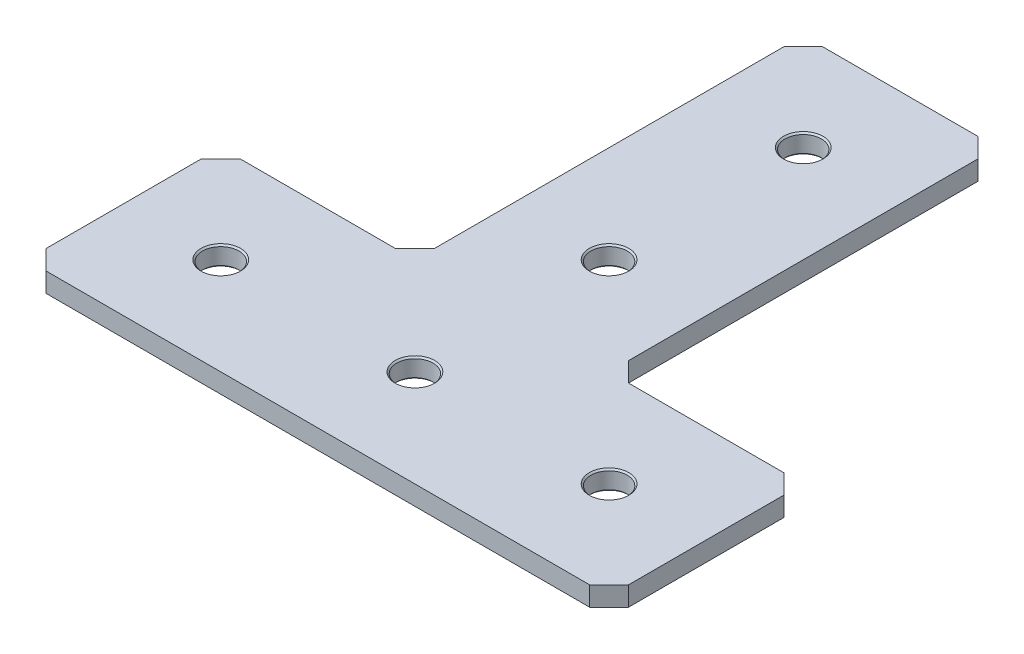
ISO-10303-21;
HEADER;
FILE_DESCRIPTION(('STEP AP214'),'2;1');
FILE_NAME('part.step','',(''),(''),'','','');
FILE_SCHEMA(('AUTOMOTIVE_DESIGN { 1 0 10303 214 1 1 1 1 }'));
ENDSEC;
DATA;
#1=APPLICATION_CONTEXT('core data for automotive mechanical design processes');
#2=APPLICATION_PROTOCOL_DEFINITION('international standard','automotive_design',2000,#1);
#3=PRODUCT_CONTEXT('',#1,'mechanical');
#4=PRODUCT('Part','Part','',(#3));
#5=PRODUCT_RELATED_PRODUCT_CATEGORY('part','',(#4));
#6=PRODUCT_DEFINITION_FORMATION('','',#4);
#7=PRODUCT_DEFINITION_CONTEXT('part definition',#1,'design');
#8=PRODUCT_DEFINITION('design','',#6,#7);
#9=PRODUCT_DEFINITION_SHAPE('','',#8);
#10=(LENGTH_UNIT() NAMED_UNIT(*) SI_UNIT(.MILLI.,.METRE.));
#11=(NAMED_UNIT(*) PLANE_ANGLE_UNIT() SI_UNIT($,.RADIAN.));
#12=(NAMED_UNIT(*) SI_UNIT($,.STERADIAN.) SOLID_ANGLE_UNIT());
#13=UNCERTAINTY_MEASURE_WITH_UNIT(LENGTH_MEASURE(1.E-05),#10,'distance_accuracy_value','');
#14=(GEOMETRIC_REPRESENTATION_CONTEXT(3) GLOBAL_UNCERTAINTY_ASSIGNED_CONTEXT((#13)) GLOBAL_UNIT_ASSIGNED_CONTEXT((#10,
#11,#12)) REPRESENTATION_CONTEXT('',''));
#15=CARTESIAN_POINT('',(0.,0.,0.));
#16=DIRECTION('',(0.,0.,1.));
#17=DIRECTION('',(1.,0.,0.));
#18=AXIS2_PLACEMENT_3D('',#15,#16,#17);
#19=CARTESIAN_POINT('',(0.,2.54,0.));
#20=DIRECTION('',(1.,0.,0.));
#21=DIRECTION('',(0.,0.,-1.));
#22=AXIS2_PLACEMENT_3D('',#19,#20,#21);
#23=PLANE('',#22);
#24=DIRECTION('',(0.,0.,1.));
#25=VECTOR('',#24,1.);
#26=CARTESIAN_POINT('',(0.,2.54,0.));
#27=LINE('',#26,#25);
#28=CARTESIAN_POINT('',(0.,2.54,-48.26));
#29=VERTEX_POINT('',#28);
#30=CARTESIAN_POINT('',(0.,2.54,-2.53999999999999));
#31=VERTEX_POINT('',#30);
#32=EDGE_CURVE('E195',#29,#31,#27,.T.);
#33=ORIENTED_EDGE('',*,*,#32,.F.);
#34=DIRECTION('',(0.,-1.,0.));
#35=VECTOR('',#34,1.);
#36=CARTESIAN_POINT('',(0.,2.54,-48.26));
#37=LINE('',#36,#35);
#38=CARTESIAN_POINT('',(0.,0.,-48.26));
#39=VERTEX_POINT('',#38);
#40=EDGE_CURVE('E241',#29,#39,#37,.T.);
#41=ORIENTED_EDGE('',*,*,#40,.T.);
#42=DIRECTION('',(0.,0.,1.));
#43=VECTOR('',#42,1.);
#44=CARTESIAN_POINT('',(0.,0.,0.));
#45=LINE('',#44,#43);
#46=CARTESIAN_POINT('',(0.,0.,-2.53999999999999));
#47=VERTEX_POINT('',#46);
#48=EDGE_CURVE('E632',#39,#47,#45,.T.);
#49=ORIENTED_EDGE('',*,*,#48,.T.);
#50=DIRECTION('',(0.,1.,0.));
#51=VECTOR('',#50,1.);
#52=CARTESIAN_POINT('',(0.,2.54,-2.53999999999999));
#53=LINE('',#52,#51);
#54=EDGE_CURVE('E239',#47,#31,#53,.T.);
#55=ORIENTED_EDGE('',*,*,#54,.T.);
#56=EDGE_LOOP('',(#33,#41,#49,#55));
#57=FACE_BOUND('',#56,.T.);
#58=ADVANCED_FACE('F37',(#57),#23,.F.);
#59=CARTESIAN_POINT('',(0.,2.54,0.));
#60=DIRECTION('',(0.,0.,1.));
#61=DIRECTION('',(1.,0.,0.));
#62=AXIS2_PLACEMENT_3D('',#59,#60,#61);
#63=PLANE('',#62);
#64=DIRECTION('',(-1.,0.,0.));
#65=VECTOR('',#64,1.);
#66=CARTESIAN_POINT('',(0.,0.,0.));
#67=LINE('',#66,#65);
#68=CARTESIAN_POINT('',(-2.54000000000001,0.,0.));
#69=VERTEX_POINT('',#68);
#70=CARTESIAN_POINT('',(-22.86,0.,0.));
#71=VERTEX_POINT('',#70);
#72=EDGE_CURVE('E184',#69,#71,#67,.T.);
#73=ORIENTED_EDGE('',*,*,#72,.T.);
#74=DIRECTION('',(0.,1.,0.));
#75=VECTOR('',#74,1.);
#76=CARTESIAN_POINT('',(-22.86,2.54,0.));
#77=LINE('',#76,#75);
#78=CARTESIAN_POINT('',(-22.86,2.54,0.));
#79=VERTEX_POINT('',#78);
#80=EDGE_CURVE('E247',#71,#79,#77,.T.);
#81=ORIENTED_EDGE('',*,*,#80,.T.);
#82=DIRECTION('',(-1.,0.,0.));
#83=VECTOR('',#82,1.);
#84=CARTESIAN_POINT('',(0.,2.54,0.));
#85=LINE('',#84,#83);
#86=CARTESIAN_POINT('',(-2.54000000000001,2.54,0.));
#87=VERTEX_POINT('',#86);
#88=EDGE_CURVE('E635',#87,#79,#85,.T.);
#89=ORIENTED_EDGE('',*,*,#88,.F.);
#90=DIRECTION('',(0.,-1.,0.));
#91=VECTOR('',#90,1.);
#92=CARTESIAN_POINT('',(-2.54000000000001,0.,0.));
#93=LINE('',#92,#91);
#94=EDGE_CURVE('E244',#87,#69,#93,.T.);
#95=ORIENTED_EDGE('',*,*,#94,.T.);
#96=EDGE_LOOP('',(#73,#81,#89,#95));
#97=FACE_BOUND('',#96,.T.);
#98=ADVANCED_FACE('F338',(#97),#63,.F.);
#99=CARTESIAN_POINT('',(-25.4,2.54,25.4));
#100=DIRECTION('',(1.,0.,0.));
#101=DIRECTION('',(0.,0.,-1.));
#102=AXIS2_PLACEMENT_3D('',#99,#100,#101);
#103=PLANE('',#102);
#104=DIRECTION('',(0.,0.,1.));
#105=VECTOR('',#104,1.);
#106=CARTESIAN_POINT('',(-25.4,0.,25.4));
#107=LINE('',#106,#105);
#108=CARTESIAN_POINT('',(-25.4,0.,2.53999999999999));
#109=VERTEX_POINT('',#108);
#110=CARTESIAN_POINT('',(-25.4,0.,22.86));
#111=VERTEX_POINT('',#110);
#112=EDGE_CURVE('E179',#109,#111,#107,.T.);
#113=ORIENTED_EDGE('',*,*,#112,.T.);
#114=DIRECTION('',(0.,1.,0.));
#115=VECTOR('',#114,1.);
#116=CARTESIAN_POINT('',(-25.4,2.54,22.86));
#117=LINE('',#116,#115);
#118=CARTESIAN_POINT('',(-25.4,2.54,22.86));
#119=VERTEX_POINT('',#118);
#120=EDGE_CURVE('E157',#111,#119,#117,.T.);
#121=ORIENTED_EDGE('',*,*,#120,.T.);
#122=DIRECTION('',(0.,0.,1.));
#123=VECTOR('',#122,1.);
#124=CARTESIAN_POINT('',(-25.4,2.54,25.4));
#125=LINE('',#124,#123);
#126=CARTESIAN_POINT('',(-25.4,2.54,2.53999999999999));
#127=VERTEX_POINT('',#126);
#128=EDGE_CURVE('E634',#127,#119,#125,.T.);
#129=ORIENTED_EDGE('',*,*,#128,.F.);
#130=DIRECTION('',(0.,-1.,0.));
#131=VECTOR('',#130,1.);
#132=CARTESIAN_POINT('',(-25.4,2.54,2.53999999999999));
#133=LINE('',#132,#131);
#134=EDGE_CURVE('E162',#127,#109,#133,.T.);
#135=ORIENTED_EDGE('',*,*,#134,.T.);
#136=EDGE_LOOP('',(#113,#121,#129,#135));
#137=FACE_BOUND('',#136,.T.);
#138=ADVANCED_FACE('F344',(#137),#103,.F.);
#139=CARTESIAN_POINT('',(50.8,2.54,25.4));
#140=DIRECTION('',(0.,0.,-1.));
#141=DIRECTION('',(-1.,0.,0.));
#142=AXIS2_PLACEMENT_3D('',#139,#140,#141);
#143=PLANE('',#142);
#144=DIRECTION('',(1.,0.,0.));
#145=VECTOR('',#144,1.);
#146=CARTESIAN_POINT('',(50.8,2.54,25.4));
#147=LINE('',#146,#145);
#148=CARTESIAN_POINT('',(-22.86,2.54,25.4));
#149=VERTEX_POINT('',#148);
#150=CARTESIAN_POINT('',(48.26,2.54,25.4));
#151=VERTEX_POINT('',#150);
#152=EDGE_CURVE('E172',#149,#151,#147,.T.);
#153=ORIENTED_EDGE('',*,*,#152,.F.);
#154=DIRECTION('',(0.,-1.,0.));
#155=VECTOR('',#154,1.);
#156=CARTESIAN_POINT('',(-22.86,2.54,25.4));
#157=LINE('',#156,#155);
#158=CARTESIAN_POINT('',(-22.86,0.,25.4));
#159=VERTEX_POINT('',#158);
#160=EDGE_CURVE('E156',#149,#159,#157,.T.);
#161=ORIENTED_EDGE('',*,*,#160,.T.);
#162=DIRECTION('',(1.,0.,0.));
#163=VECTOR('',#162,1.);
#164=CARTESIAN_POINT('',(50.8,0.,25.4));
#165=LINE('',#164,#163);
#166=CARTESIAN_POINT('',(48.26,0.,25.4));
#167=VERTEX_POINT('',#166);
#168=EDGE_CURVE('E169',#159,#167,#165,.T.);
#169=ORIENTED_EDGE('',*,*,#168,.T.);
#170=DIRECTION('',(0.,1.,0.));
#171=VECTOR('',#170,1.);
#172=CARTESIAN_POINT('',(48.26,2.54,25.4));
#173=LINE('',#172,#171);
#174=EDGE_CURVE('E174',#167,#151,#173,.T.);
#175=ORIENTED_EDGE('',*,*,#174,.T.);
#176=EDGE_LOOP('',(#153,#161,#169,#175));
#177=FACE_BOUND('',#176,.T.);
#178=ADVANCED_FACE('F168',(#177),#143,.F.);
#179=CARTESIAN_POINT('',(50.8,2.54,25.4));
#180=DIRECTION('',(-1.,0.,0.));
#181=DIRECTION('',(0.,0.,1.));
#182=AXIS2_PLACEMENT_3D('',#179,#180,#181);
#183=PLANE('',#182);
#184=DIRECTION('',(0.,0.,-1.));
#185=VECTOR('',#184,1.);
#186=CARTESIAN_POINT('',(50.8,2.54,25.4));
#187=LINE('',#186,#185);
#188=CARTESIAN_POINT('',(50.8,2.54,22.86));
#189=VERTEX_POINT('',#188);
#190=CARTESIAN_POINT('',(50.8,2.54,2.54000000000001));
#191=VERTEX_POINT('',#190);
#192=EDGE_CURVE('E637',#189,#191,#187,.T.);
#193=ORIENTED_EDGE('',*,*,#192,.F.);
#194=DIRECTION('',(0.,-1.,0.));
#195=VECTOR('',#194,1.);
#196=CARTESIAN_POINT('',(50.8,2.54,22.86));
#197=LINE('',#196,#195);
#198=CARTESIAN_POINT('',(50.8,0.,22.86));
#199=VERTEX_POINT('',#198);
#200=EDGE_CURVE('E222',#189,#199,#197,.T.);
#201=ORIENTED_EDGE('',*,*,#200,.T.);
#202=DIRECTION('',(0.,0.,-1.));
#203=VECTOR('',#202,1.);
#204=CARTESIAN_POINT('',(50.8,0.,25.4));
#205=LINE('',#204,#203);
#206=CARTESIAN_POINT('',(50.8,0.,2.54000000000001));
#207=VERTEX_POINT('',#206);
#208=EDGE_CURVE('E178',#199,#207,#205,.T.);
#209=ORIENTED_EDGE('',*,*,#208,.T.);
#210=DIRECTION('',(0.,1.,0.));
#211=VECTOR('',#210,1.);
#212=CARTESIAN_POINT('',(50.8,2.54,2.54));
#213=LINE('',#212,#211);
#214=EDGE_CURVE('E220',#207,#191,#213,.T.);
#215=ORIENTED_EDGE('',*,*,#214,.T.);
#216=EDGE_LOOP('',(#193,#201,#209,#215));
#217=FACE_BOUND('',#216,.T.);
#218=ADVANCED_FACE('F583',(#217),#183,.F.);
#219=CARTESIAN_POINT('',(50.8,2.54,0.));
#220=DIRECTION('',(0.,0.,1.));
#221=DIRECTION('',(1.,0.,0.));
#222=AXIS2_PLACEMENT_3D('',#219,#220,#221);
#223=PLANE('',#222);
#224=DIRECTION('',(-1.,0.,0.));
#225=VECTOR('',#224,1.);
#226=CARTESIAN_POINT('',(50.8,2.54,0.));
#227=LINE('',#226,#225);
#228=CARTESIAN_POINT('',(48.26,2.54,0.));
#229=VERTEX_POINT('',#228);
#230=CARTESIAN_POINT('',(27.94,2.54,0.));
#231=VERTEX_POINT('',#230);
#232=EDGE_CURVE('E644',#229,#231,#227,.T.);
#233=ORIENTED_EDGE('',*,*,#232,.F.);
#234=DIRECTION('',(0.,-1.,0.));
#235=VECTOR('',#234,1.);
#236=CARTESIAN_POINT('',(48.26,2.54,0.));
#237=LINE('',#236,#235);
#238=CARTESIAN_POINT('',(48.26,0.,0.));
#239=VERTEX_POINT('',#238);
#240=EDGE_CURVE('E227',#229,#239,#237,.T.);
#241=ORIENTED_EDGE('',*,*,#240,.T.);
#242=DIRECTION('',(-1.,0.,0.));
#243=VECTOR('',#242,1.);
#244=CARTESIAN_POINT('',(50.8,0.,0.));
#245=LINE('',#244,#243);
#246=CARTESIAN_POINT('',(27.94,0.,0.));
#247=VERTEX_POINT('',#246);
#248=EDGE_CURVE('E182',#239,#247,#245,.T.);
#249=ORIENTED_EDGE('',*,*,#248,.T.);
#250=DIRECTION('',(0.,1.,0.));
#251=VECTOR('',#250,1.);
#252=CARTESIAN_POINT('',(27.94,2.54,0.));
#253=LINE('',#252,#251);
#254=EDGE_CURVE('E225',#247,#231,#253,.T.);
#255=ORIENTED_EDGE('',*,*,#254,.T.);
#256=EDGE_LOOP('',(#233,#241,#249,#255));
#257=FACE_BOUND('',#256,.T.);
#258=ADVANCED_FACE('F573',(#257),#223,.F.);
#259=CARTESIAN_POINT('',(25.4,2.54,0.));
#260=DIRECTION('',(-1.,0.,0.));
#261=DIRECTION('',(0.,0.,1.));
#262=AXIS2_PLACEMENT_3D('',#259,#260,#261);
#263=PLANE('',#262);
#264=DIRECTION('',(0.,0.,-1.));
#265=VECTOR('',#264,1.);
#266=CARTESIAN_POINT('',(25.4,2.54,0.));
#267=LINE('',#266,#265);
#268=CARTESIAN_POINT('',(25.4,2.54,-2.53999999999999));
#269=VERTEX_POINT('',#268);
#270=CARTESIAN_POINT('',(25.4,2.54,-48.26));
#271=VERTEX_POINT('',#270);
#272=EDGE_CURVE('E647',#269,#271,#267,.T.);
#273=ORIENTED_EDGE('',*,*,#272,.F.);
#274=DIRECTION('',(0.,-1.,0.));
#275=VECTOR('',#274,1.);
#276=CARTESIAN_POINT('',(25.4,0.,-2.53999999999999));
#277=LINE('',#276,#275);
#278=CARTESIAN_POINT('',(25.4,0.,-2.53999999999999));
#279=VERTEX_POINT('',#278);
#280=EDGE_CURVE('E232',#269,#279,#277,.T.);
#281=ORIENTED_EDGE('',*,*,#280,.T.);
#282=DIRECTION('',(0.,0.,-1.));
#283=VECTOR('',#282,1.);
#284=CARTESIAN_POINT('',(25.4,0.,0.));
#285=LINE('',#284,#283);
#286=CARTESIAN_POINT('',(25.4,0.,-48.26));
#287=VERTEX_POINT('',#286);
#288=EDGE_CURVE('E190',#279,#287,#285,.T.);
#289=ORIENTED_EDGE('',*,*,#288,.T.);
#290=DIRECTION('',(0.,1.,0.));
#291=VECTOR('',#290,1.);
#292=CARTESIAN_POINT('',(25.4,2.54,-48.26));
#293=LINE('',#292,#291);
#294=EDGE_CURVE('E230',#287,#271,#293,.T.);
#295=ORIENTED_EDGE('',*,*,#294,.T.);
#296=EDGE_LOOP('',(#273,#281,#289,#295));
#297=FACE_BOUND('',#296,.T.);
#298=ADVANCED_FACE('F564',(#297),#263,.F.);
#299=CARTESIAN_POINT('',(0.,2.54,-50.8));
#300=DIRECTION('',(0.,0.,1.));
#301=DIRECTION('',(1.,0.,0.));
#302=AXIS2_PLACEMENT_3D('',#299,#300,#301);
#303=PLANE('',#302);
#304=DIRECTION('',(-1.,0.,0.));
#305=VECTOR('',#304,1.);
#306=CARTESIAN_POINT('',(0.,2.54,-50.8));
#307=LINE('',#306,#305);
#308=CARTESIAN_POINT('',(22.86,2.54,-50.8));
#309=VERTEX_POINT('',#308);
#310=CARTESIAN_POINT('',(2.54,2.54,-50.8));
#311=VERTEX_POINT('',#310);
#312=EDGE_CURVE('E196',#309,#311,#307,.T.);
#313=ORIENTED_EDGE('',*,*,#312,.F.);
#314=DIRECTION('',(0.,-1.,0.));
#315=VECTOR('',#314,1.);
#316=CARTESIAN_POINT('',(22.86,2.54,-50.8));
#317=LINE('',#316,#315);
#318=CARTESIAN_POINT('',(22.86,0.,-50.8));
#319=VERTEX_POINT('',#318);
#320=EDGE_CURVE('E236',#309,#319,#317,.T.);
#321=ORIENTED_EDGE('',*,*,#320,.T.);
#322=DIRECTION('',(-1.,0.,0.));
#323=VECTOR('',#322,1.);
#324=CARTESIAN_POINT('',(0.,0.,-50.8));
#325=LINE('',#324,#323);
#326=CARTESIAN_POINT('',(2.54,0.,-50.8));
#327=VERTEX_POINT('',#326);
#328=EDGE_CURVE('E193',#319,#327,#325,.T.);
#329=ORIENTED_EDGE('',*,*,#328,.T.);
#330=DIRECTION('',(0.,1.,0.));
#331=VECTOR('',#330,1.);
#332=CARTESIAN_POINT('',(2.54,2.54,-50.8));
#333=LINE('',#332,#331);
#334=EDGE_CURVE('E52',#327,#311,#333,.T.);
#335=ORIENTED_EDGE('',*,*,#334,.T.);
#336=EDGE_LOOP('',(#313,#321,#329,#335));
#337=FACE_BOUND('',#336,.T.);
#338=ADVANCED_FACE('F332',(#337),#303,.F.);
#339=CARTESIAN_POINT('',(0.,2.54,0.));
#340=DIRECTION('',(0.,-1.,0.));
#341=DIRECTION('',(0.,0.,-1.));
#342=AXIS2_PLACEMENT_3D('',#339,#340,#341);
#343=PLANE('',#342);
#344=CARTESIAN_POINT('',(-12.7,2.54,12.7));
#345=DIRECTION('',(0.,-1.,0.));
#346=DIRECTION('',(0.,0.,-1.));
#347=AXIS2_PLACEMENT_3D('',#344,#345,#346);
#348=CIRCLE('',#347,2.58124999999995);
#349=CARTESIAN_POINT('',(-12.7,2.54,10.11875));
#350=VERTEX_POINT('',#349);
#351=EDGE_CURVE('E275',#350,#350,#348,.T.);
#352=ORIENTED_EDGE('',*,*,#351,.T.);
#353=EDGE_LOOP('',(#352));
#354=FACE_BOUND('',#353,.T.);
#355=CARTESIAN_POINT('',(38.1,2.54,12.7));
#356=DIRECTION('',(0.,-1.,0.));
#357=DIRECTION('',(0.,0.,-1.));
#358=AXIS2_PLACEMENT_3D('',#355,#356,#357);
#359=CIRCLE('',#358,2.58124999999995);
#360=CARTESIAN_POINT('',(38.1,2.54,10.11875));
#361=VERTEX_POINT('',#360);
#362=EDGE_CURVE('E272',#361,#361,#359,.T.);
#363=ORIENTED_EDGE('',*,*,#362,.T.);
#364=EDGE_LOOP('',(#363));
#365=FACE_BOUND('',#364,.T.);
#366=CARTESIAN_POINT('',(12.7,2.54,12.7));
#367=DIRECTION('',(0.,-1.,0.));
#368=DIRECTION('',(0.,0.,-1.));
#369=AXIS2_PLACEMENT_3D('',#366,#367,#368);
#370=CIRCLE('',#369,2.58124999999999);
#371=CARTESIAN_POINT('',(12.7,2.54,10.11875));
#372=VERTEX_POINT('',#371);
#373=EDGE_CURVE('E269',#372,#372,#370,.T.);
#374=ORIENTED_EDGE('',*,*,#373,.T.);
#375=EDGE_LOOP('',(#374));
#376=FACE_BOUND('',#375,.T.);
#377=CARTESIAN_POINT('',(12.7,2.54,-12.7));
#378=DIRECTION('',(0.,-1.,0.));
#379=DIRECTION('',(0.,0.,-1.));
#380=AXIS2_PLACEMENT_3D('',#377,#378,#379);
#381=CIRCLE('',#380,2.58124999999999);
#382=CARTESIAN_POINT('',(12.7,2.54,-15.28125));
#383=VERTEX_POINT('',#382);
#384=EDGE_CURVE('E266',#383,#383,#381,.T.);
#385=ORIENTED_EDGE('',*,*,#384,.T.);
#386=EDGE_LOOP('',(#385));
#387=FACE_BOUND('',#386,.T.);
#388=CARTESIAN_POINT('',(12.7,2.54,-38.1));
#389=DIRECTION('',(0.,-1.,0.));
#390=DIRECTION('',(0.,0.,-1.));
#391=AXIS2_PLACEMENT_3D('',#388,#389,#390);
#392=CIRCLE('',#391,2.58124999999999);
#393=CARTESIAN_POINT('',(12.7,2.54,-40.68125));
#394=VERTEX_POINT('',#393);
#395=EDGE_CURVE('E263',#394,#394,#392,.T.);
#396=ORIENTED_EDGE('',*,*,#395,.T.);
#397=EDGE_LOOP('',(#396));
#398=FACE_BOUND('',#397,.T.);
#399=ORIENTED_EDGE('',*,*,#128,.T.);
#400=DIRECTION('',(-0.707106781186546,0.,-0.707106781186549));
#401=VECTOR('',#400,1.);
#402=CARTESIAN_POINT('',(-22.86,2.54,25.4));
#403=LINE('',#402,#401);
#404=EDGE_CURVE('E218',#119,#149,#403,.F.);
#405=ORIENTED_EDGE('',*,*,#404,.T.);
#406=ORIENTED_EDGE('',*,*,#152,.T.);
#407=DIRECTION('',(-0.707106781186548,0.,0.707106781186548));
#408=VECTOR('',#407,1.);
#409=CARTESIAN_POINT('',(50.8,2.54,22.86));
#410=LINE('',#409,#408);
#411=EDGE_CURVE('E216',#151,#189,#410,.F.);
#412=ORIENTED_EDGE('',*,*,#411,.T.);
#413=ORIENTED_EDGE('',*,*,#192,.T.);
#414=DIRECTION('',(0.707106781186547,0.,0.707106781186548));
#415=VECTOR('',#414,1.);
#416=CARTESIAN_POINT('',(48.26,2.54,0.));
#417=LINE('',#416,#415);
#418=EDGE_CURVE('E214',#191,#229,#417,.F.);
#419=ORIENTED_EDGE('',*,*,#418,.T.);
#420=ORIENTED_EDGE('',*,*,#232,.T.);
#421=DIRECTION('',(0.707106781186546,0.,0.707106781186549));
#422=VECTOR('',#421,1.);
#423=CARTESIAN_POINT('',(13.9700000000001,2.54,-13.97));
#424=LINE('',#423,#422);
#425=EDGE_CURVE('E251',#231,#269,#424,.F.);
#426=ORIENTED_EDGE('',*,*,#425,.T.);
#427=ORIENTED_EDGE('',*,*,#272,.T.);
#428=DIRECTION('',(0.707106781186548,0.,0.707106781186548));
#429=VECTOR('',#428,1.);
#430=CARTESIAN_POINT('',(22.86,2.54,-50.8));
#431=LINE('',#430,#429);
#432=EDGE_CURVE('E59',#271,#309,#431,.F.);
#433=ORIENTED_EDGE('',*,*,#432,.T.);
#434=ORIENTED_EDGE('',*,*,#312,.T.);
#435=DIRECTION('',(0.707106781186548,0.,-0.707106781186548));
#436=VECTOR('',#435,1.);
#437=CARTESIAN_POINT('',(0.,2.54,-48.26));
#438=LINE('',#437,#436);
#439=EDGE_CURVE('E211',#311,#29,#438,.F.);
#440=ORIENTED_EDGE('',*,*,#439,.T.);
#441=ORIENTED_EDGE('',*,*,#32,.T.);
#442=DIRECTION('',(0.707106781186551,0.,-0.707106781186544));
#443=VECTOR('',#442,1.);
#444=CARTESIAN_POINT('',(-1.26999999999999,2.54,-1.27000000000001));
#445=LINE('',#444,#443);
#446=EDGE_CURVE('E255',#31,#87,#445,.F.);
#447=ORIENTED_EDGE('',*,*,#446,.T.);
#448=ORIENTED_EDGE('',*,*,#88,.T.);
#449=DIRECTION('',(0.707106781186549,0.,-0.707106781186546));
#450=VECTOR('',#449,1.);
#451=CARTESIAN_POINT('',(-25.4,2.54,2.53999999999999));
#452=LINE('',#451,#450);
#453=EDGE_CURVE('E209',#79,#127,#452,.F.);
#454=ORIENTED_EDGE('',*,*,#453,.T.);
#455=EDGE_LOOP('',(#399,#405,#406,#412,#413,#419,#420,#426,#427,#433,#434,#440,#441,#447,#448,#454));
#456=FACE_BOUND('',#455,.T.);
#457=ADVANCED_FACE('F322',(#354,#365,#376,#387,#398,#456),#343,.F.);
#458=CARTESIAN_POINT('',(0.,0.,0.));
#459=DIRECTION('',(0.,-1.,0.));
#460=DIRECTION('',(0.,0.,-1.));
#461=AXIS2_PLACEMENT_3D('',#458,#459,#460);
#462=PLANE('',#461);
#463=CARTESIAN_POINT('',(-12.7,0.,12.7));
#464=DIRECTION('',(0.,-1.,0.));
#465=DIRECTION('',(0.,0.,-1.));
#466=AXIS2_PLACEMENT_3D('',#463,#464,#465);
#467=CIRCLE('',#466,2.58124999999999);
#468=CARTESIAN_POINT('',(-12.7,0.,10.11875));
#469=VERTEX_POINT('',#468);
#470=EDGE_CURVE('E290',#469,#469,#467,.F.);
#471=ORIENTED_EDGE('',*,*,#470,.T.);
#472=EDGE_LOOP('',(#471));
#473=FACE_BOUND('',#472,.T.);
#474=CARTESIAN_POINT('',(38.1,0.,12.7));
#475=DIRECTION('',(0.,-1.,0.));
#476=DIRECTION('',(0.,0.,-1.));
#477=AXIS2_PLACEMENT_3D('',#474,#475,#476);
#478=CIRCLE('',#477,2.58124999999999);
#479=CARTESIAN_POINT('',(38.1,0.,10.11875));
#480=VERTEX_POINT('',#479);
#481=EDGE_CURVE('E287',#480,#480,#478,.F.);
#482=ORIENTED_EDGE('',*,*,#481,.T.);
#483=EDGE_LOOP('',(#482));
#484=FACE_BOUND('',#483,.T.);
#485=CARTESIAN_POINT('',(12.7,0.,12.7));
#486=DIRECTION('',(0.,-1.,0.));
#487=DIRECTION('',(0.,0.,-1.));
#488=AXIS2_PLACEMENT_3D('',#485,#486,#487);
#489=CIRCLE('',#488,2.58124999999999);
#490=CARTESIAN_POINT('',(12.7,0.,10.11875));
#491=VERTEX_POINT('',#490);
#492=EDGE_CURVE('E284',#491,#491,#489,.F.);
#493=ORIENTED_EDGE('',*,*,#492,.T.);
#494=EDGE_LOOP('',(#493));
#495=FACE_BOUND('',#494,.T.);
#496=CARTESIAN_POINT('',(12.7,0.,-12.7));
#497=DIRECTION('',(0.,-1.,0.));
#498=DIRECTION('',(0.,0.,-1.));
#499=AXIS2_PLACEMENT_3D('',#496,#497,#498);
#500=CIRCLE('',#499,2.58124999999999);
#501=CARTESIAN_POINT('',(12.7,0.,-15.28125));
#502=VERTEX_POINT('',#501);
#503=EDGE_CURVE('E281',#502,#502,#500,.F.);
#504=ORIENTED_EDGE('',*,*,#503,.T.);
#505=EDGE_LOOP('',(#504));
#506=FACE_BOUND('',#505,.T.);
#507=CARTESIAN_POINT('',(12.7,0.,-38.1));
#508=DIRECTION('',(0.,-1.,0.));
#509=DIRECTION('',(0.,0.,-1.));
#510=AXIS2_PLACEMENT_3D('',#507,#508,#509);
#511=CIRCLE('',#510,2.58124999999999);
#512=CARTESIAN_POINT('',(12.7,0.,-40.68125));
#513=VERTEX_POINT('',#512);
#514=EDGE_CURVE('E278',#513,#513,#511,.F.);
#515=ORIENTED_EDGE('',*,*,#514,.T.);
#516=EDGE_LOOP('',(#515));
#517=FACE_BOUND('',#516,.T.);
#518=ORIENTED_EDGE('',*,*,#168,.F.);
#519=DIRECTION('',(0.707106781186546,0.,0.707106781186549));
#520=VECTOR('',#519,1.);
#521=CARTESIAN_POINT('',(-24.1300000000001,0.,24.13));
#522=LINE('',#521,#520);
#523=EDGE_CURVE('E152',#159,#111,#522,.F.);
#524=ORIENTED_EDGE('',*,*,#523,.T.);
#525=ORIENTED_EDGE('',*,*,#112,.F.);
#526=DIRECTION('',(-0.707106781186549,0.,0.707106781186546));
#527=VECTOR('',#526,1.);
#528=CARTESIAN_POINT('',(-11.4299999999999,0.,-11.43));
#529=LINE('',#528,#527);
#530=EDGE_CURVE('E173',#109,#71,#529,.F.);
#531=ORIENTED_EDGE('',*,*,#530,.T.);
#532=ORIENTED_EDGE('',*,*,#72,.F.);
#533=DIRECTION('',(-0.707106781186551,0.,0.707106781186544));
#534=VECTOR('',#533,1.);
#535=CARTESIAN_POINT('',(-2.54000000000001,0.,0.));
#536=LINE('',#535,#534);
#537=EDGE_CURVE('E253',#69,#47,#536,.F.);
#538=ORIENTED_EDGE('',*,*,#537,.T.);
#539=ORIENTED_EDGE('',*,*,#48,.F.);
#540=DIRECTION('',(-0.707106781186548,0.,0.707106781186548));
#541=VECTOR('',#540,1.);
#542=CARTESIAN_POINT('',(-24.13,0.,-24.13));
#543=LINE('',#542,#541);
#544=EDGE_CURVE('E199',#39,#327,#543,.F.);
#545=ORIENTED_EDGE('',*,*,#544,.T.);
#546=ORIENTED_EDGE('',*,*,#328,.F.);
#547=DIRECTION('',(-0.707106781186548,0.,-0.707106781186548));
#548=VECTOR('',#547,1.);
#549=CARTESIAN_POINT('',(36.83,0.,-36.83));
#550=LINE('',#549,#548);
#551=EDGE_CURVE('E201',#319,#287,#550,.F.);
#552=ORIENTED_EDGE('',*,*,#551,.T.);
#553=ORIENTED_EDGE('',*,*,#288,.F.);
#554=DIRECTION('',(-0.707106781186546,0.,-0.707106781186549));
#555=VECTOR('',#554,1.);
#556=CARTESIAN_POINT('',(25.4,0.,-2.53999999999999));
#557=LINE('',#556,#555);
#558=EDGE_CURVE('E249',#279,#247,#557,.F.);
#559=ORIENTED_EDGE('',*,*,#558,.T.);
#560=ORIENTED_EDGE('',*,*,#248,.F.);
#561=DIRECTION('',(-0.707106781186547,0.,-0.707106781186548));
#562=VECTOR('',#561,1.);
#563=CARTESIAN_POINT('',(24.13,0.,-24.13));
#564=LINE('',#563,#562);
#565=EDGE_CURVE('E203',#239,#207,#564,.F.);
#566=ORIENTED_EDGE('',*,*,#565,.T.);
#567=ORIENTED_EDGE('',*,*,#208,.F.);
#568=DIRECTION('',(0.707106781186548,0.,-0.707106781186548));
#569=VECTOR('',#568,1.);
#570=CARTESIAN_POINT('',(36.83,0.,36.83));
#571=LINE('',#570,#569);
#572=EDGE_CURVE('E163',#199,#167,#571,.F.);
#573=ORIENTED_EDGE('',*,*,#572,.T.);
#574=EDGE_LOOP('',(#518,#524,#525,#531,#532,#538,#539,#545,#546,#552,#553,#559,#560,#566,#567,#573));
#575=FACE_BOUND('',#574,.T.);
#576=ADVANCED_FACE('F176',(#473,#484,#495,#506,#517,#575),#462,.T.);
#577=CARTESIAN_POINT('',(-12.7,2.54,12.7));
#578=DIRECTION('',(0.,1.,0.));
#579=DIRECTION('',(0.,0.,1.));
#580=AXIS2_PLACEMENT_3D('',#577,#578,#579);
#581=CYLINDRICAL_SURFACE('',#580,2.38125);
#582=CARTESIAN_POINT('',(-12.7,2.34000000000004,12.7));
#583=DIRECTION('',(0.,-1.,0.));
#584=DIRECTION('',(0.,0.,-1.));
#585=AXIS2_PLACEMENT_3D('',#582,#583,#584);
#586=CIRCLE('',#585,2.38125);
#587=CARTESIAN_POINT('',(-12.7,2.34000000000004,10.31875));
#588=VERTEX_POINT('',#587);
#589=EDGE_CURVE('E260',#588,#588,#586,.F.);
#590=ORIENTED_EDGE('',*,*,#589,.T.);
#591=EDGE_LOOP('',(#590));
#592=FACE_BOUND('',#591,.T.);
#593=CARTESIAN_POINT('',(-12.7,0.199999999999988,12.7));
#594=DIRECTION('',(0.,-1.,0.));
#595=DIRECTION('',(0.,0.,-1.));
#596=AXIS2_PLACEMENT_3D('',#593,#594,#595);
#597=CIRCLE('',#596,2.38125);
#598=CARTESIAN_POINT('',(-12.7,0.199999999999988,10.31875));
#599=VERTEX_POINT('',#598);
#600=EDGE_CURVE('E257',#599,#599,#597,.T.);
#601=ORIENTED_EDGE('',*,*,#600,.T.);
#602=EDGE_LOOP('',(#601));
#603=FACE_BOUND('',#602,.T.);
#604=ADVANCED_FACE('F321',(#592,#603),#581,.F.);
#605=CARTESIAN_POINT('',(38.1,2.54,12.7));
#606=DIRECTION('',(0.,1.,0.));
#607=DIRECTION('',(0.,0.,1.));
#608=AXIS2_PLACEMENT_3D('',#605,#606,#607);
#609=CYLINDRICAL_SURFACE('',#608,2.38125);
#610=CARTESIAN_POINT('',(38.1,2.34000000000004,12.7));
#611=DIRECTION('',(0.,-1.,0.));
#612=DIRECTION('',(0.,0.,-1.));
#613=AXIS2_PLACEMENT_3D('',#610,#611,#612);
#614=CIRCLE('',#613,2.38125);
#615=CARTESIAN_POINT('',(38.1,2.34000000000004,10.31875));
#616=VERTEX_POINT('',#615);
#617=EDGE_CURVE('E296',#616,#616,#614,.F.);
#618=ORIENTED_EDGE('',*,*,#617,.T.);
#619=EDGE_LOOP('',(#618));
#620=FACE_BOUND('',#619,.T.);
#621=CARTESIAN_POINT('',(38.1,0.199999999999986,12.7));
#622=DIRECTION('',(0.,-1.,0.));
#623=DIRECTION('',(0.,0.,-1.));
#624=AXIS2_PLACEMENT_3D('',#621,#622,#623);
#625=CIRCLE('',#624,2.38125);
#626=CARTESIAN_POINT('',(38.1,0.199999999999986,10.31875));
#627=VERTEX_POINT('',#626);
#628=EDGE_CURVE('E293',#627,#627,#625,.T.);
#629=ORIENTED_EDGE('',*,*,#628,.T.);
#630=EDGE_LOOP('',(#629));
#631=FACE_BOUND('',#630,.T.);
#632=ADVANCED_FACE('F329',(#620,#631),#609,.F.);
#633=CARTESIAN_POINT('',(12.7,2.54,12.7));
#634=DIRECTION('',(0.,1.,0.));
#635=DIRECTION('',(0.,0.,1.));
#636=AXIS2_PLACEMENT_3D('',#633,#634,#635);
#637=CYLINDRICAL_SURFACE('',#636,2.38125);
#638=CARTESIAN_POINT('',(12.7,2.33999999999999,12.7));
#639=DIRECTION('',(0.,-1.,0.));
#640=DIRECTION('',(0.,0.,-1.));
#641=AXIS2_PLACEMENT_3D('',#638,#639,#640);
#642=CIRCLE('',#641,2.38125);
#643=CARTESIAN_POINT('',(12.7,2.33999999999999,10.31875));
#644=VERTEX_POINT('',#643);
#645=EDGE_CURVE('E302',#644,#644,#642,.F.);
#646=ORIENTED_EDGE('',*,*,#645,.T.);
#647=EDGE_LOOP('',(#646));
#648=FACE_BOUND('',#647,.T.);
#649=CARTESIAN_POINT('',(12.7,0.199999999999988,12.7));
#650=DIRECTION('',(0.,-1.,0.));
#651=DIRECTION('',(0.,0.,-1.));
#652=AXIS2_PLACEMENT_3D('',#649,#650,#651);
#653=CIRCLE('',#652,2.38125);
#654=CARTESIAN_POINT('',(12.7,0.199999999999988,10.31875));
#655=VERTEX_POINT('',#654);
#656=EDGE_CURVE('E299',#655,#655,#653,.T.);
#657=ORIENTED_EDGE('',*,*,#656,.T.);
#658=EDGE_LOOP('',(#657));
#659=FACE_BOUND('',#658,.T.);
#660=ADVANCED_FACE('F425',(#648,#659),#637,.F.);
#661=CARTESIAN_POINT('',(12.7,2.54,-12.7));
#662=DIRECTION('',(0.,1.,0.));
#663=DIRECTION('',(0.,0.,1.));
#664=AXIS2_PLACEMENT_3D('',#661,#662,#663);
#665=CYLINDRICAL_SURFACE('',#664,2.38125);
#666=CARTESIAN_POINT('',(12.7,2.33999999999999,-12.7));
#667=DIRECTION('',(0.,-1.,0.));
#668=DIRECTION('',(0.,0.,-1.));
#669=AXIS2_PLACEMENT_3D('',#666,#667,#668);
#670=CIRCLE('',#669,2.38125);
#671=CARTESIAN_POINT('',(12.7,2.33999999999999,-15.08125));
#672=VERTEX_POINT('',#671);
#673=EDGE_CURVE('E308',#672,#672,#670,.F.);
#674=ORIENTED_EDGE('',*,*,#673,.T.);
#675=EDGE_LOOP('',(#674));
#676=FACE_BOUND('',#675,.T.);
#677=CARTESIAN_POINT('',(12.7,0.199999999999988,-12.7));
#678=DIRECTION('',(0.,-1.,0.));
#679=DIRECTION('',(0.,0.,-1.));
#680=AXIS2_PLACEMENT_3D('',#677,#678,#679);
#681=CIRCLE('',#680,2.38125);
#682=CARTESIAN_POINT('',(12.7,0.199999999999988,-15.08125));
#683=VERTEX_POINT('',#682);
#684=EDGE_CURVE('E305',#683,#683,#681,.T.);
#685=ORIENTED_EDGE('',*,*,#684,.T.);
#686=EDGE_LOOP('',(#685));
#687=FACE_BOUND('',#686,.T.);
#688=ADVANCED_FACE('F420',(#676,#687),#665,.F.);
#689=CARTESIAN_POINT('',(12.7,2.54,-38.1));
#690=DIRECTION('',(0.,1.,0.));
#691=DIRECTION('',(0.,0.,1.));
#692=AXIS2_PLACEMENT_3D('',#689,#690,#691);
#693=CYLINDRICAL_SURFACE('',#692,2.38125);
#694=CARTESIAN_POINT('',(12.7,2.33999999999999,-38.1));
#695=DIRECTION('',(0.,-1.,0.));
#696=DIRECTION('',(0.,0.,-1.));
#697=AXIS2_PLACEMENT_3D('',#694,#695,#696);
#698=CIRCLE('',#697,2.38125);
#699=CARTESIAN_POINT('',(12.7,2.33999999999999,-40.48125));
#700=VERTEX_POINT('',#699);
#701=EDGE_CURVE('E11',#700,#700,#698,.F.);
#702=ORIENTED_EDGE('',*,*,#701,.T.);
#703=EDGE_LOOP('',(#702));
#704=FACE_BOUND('',#703,.T.);
#705=CARTESIAN_POINT('',(12.7,0.199999999999988,-38.1));
#706=DIRECTION('',(0.,-1.,0.));
#707=DIRECTION('',(0.,0.,-1.));
#708=AXIS2_PLACEMENT_3D('',#705,#706,#707);
#709=CIRCLE('',#708,2.38125);
#710=CARTESIAN_POINT('',(12.7,0.199999999999988,-40.48125));
#711=VERTEX_POINT('',#710);
#712=EDGE_CURVE('E45',#711,#711,#709,.T.);
#713=ORIENTED_EDGE('',*,*,#712,.T.);
#714=EDGE_LOOP('',(#713));
#715=FACE_BOUND('',#714,.T.);
#716=ADVANCED_FACE('F313',(#704,#715),#693,.F.);
#717=CARTESIAN_POINT('',(-22.86,2.54,25.4));
#718=DIRECTION('',(0.707106781186549,0.,-0.707106781186546));
#719=DIRECTION('',(0.,-1.,0.));
#720=AXIS2_PLACEMENT_3D('',#717,#718,#719);
#721=PLANE('',#720);
#722=ORIENTED_EDGE('',*,*,#404,.F.);
#723=ORIENTED_EDGE('',*,*,#120,.F.);
#724=ORIENTED_EDGE('',*,*,#523,.F.);
#725=ORIENTED_EDGE('',*,*,#160,.F.);
#726=EDGE_LOOP('',(#722,#723,#724,#725));
#727=FACE_BOUND('',#726,.T.);
#728=ADVANCED_FACE('F155',(#727),#721,.F.);
#729=CARTESIAN_POINT('',(50.8,2.54,22.86));
#730=DIRECTION('',(-0.707106781186547,0.,-0.707106781186547));
#731=DIRECTION('',(0.,-1.,0.));
#732=AXIS2_PLACEMENT_3D('',#729,#730,#731);
#733=PLANE('',#732);
#734=ORIENTED_EDGE('',*,*,#411,.F.);
#735=ORIENTED_EDGE('',*,*,#174,.F.);
#736=ORIENTED_EDGE('',*,*,#572,.F.);
#737=ORIENTED_EDGE('',*,*,#200,.F.);
#738=EDGE_LOOP('',(#734,#735,#736,#737));
#739=FACE_BOUND('',#738,.T.);
#740=ADVANCED_FACE('F352',(#739),#733,.F.);
#741=CARTESIAN_POINT('',(48.26,2.54,0.));
#742=DIRECTION('',(-0.707106781186548,0.,0.707106781186547));
#743=DIRECTION('',(0.,-1.,0.));
#744=AXIS2_PLACEMENT_3D('',#741,#742,#743);
#745=PLANE('',#744);
#746=ORIENTED_EDGE('',*,*,#418,.F.);
#747=ORIENTED_EDGE('',*,*,#214,.F.);
#748=ORIENTED_EDGE('',*,*,#565,.F.);
#749=ORIENTED_EDGE('',*,*,#240,.F.);
#750=EDGE_LOOP('',(#746,#747,#748,#749));
#751=FACE_BOUND('',#750,.T.);
#752=ADVANCED_FACE('F355',(#751),#745,.F.);
#753=CARTESIAN_POINT('',(25.4,2.54,-2.53999999999999));
#754=DIRECTION('',(0.707106781186549,0.,-0.707106781186546));
#755=DIRECTION('',(0.,1.,0.));
#756=AXIS2_PLACEMENT_3D('',#753,#754,#755);
#757=PLANE('',#756);
#758=ORIENTED_EDGE('',*,*,#425,.F.);
#759=ORIENTED_EDGE('',*,*,#254,.F.);
#760=ORIENTED_EDGE('',*,*,#558,.F.);
#761=ORIENTED_EDGE('',*,*,#280,.F.);
#762=EDGE_LOOP('',(#758,#759,#760,#761));
#763=FACE_BOUND('',#762,.T.);
#764=ADVANCED_FACE('F359',(#763),#757,.T.);
#765=CARTESIAN_POINT('',(22.86,2.54,-50.8));
#766=DIRECTION('',(-0.707106781186547,0.,0.707106781186547));
#767=DIRECTION('',(0.,-1.,0.));
#768=AXIS2_PLACEMENT_3D('',#765,#766,#767);
#769=PLANE('',#768);
#770=ORIENTED_EDGE('',*,*,#432,.F.);
#771=ORIENTED_EDGE('',*,*,#294,.F.);
#772=ORIENTED_EDGE('',*,*,#551,.F.);
#773=ORIENTED_EDGE('',*,*,#320,.F.);
#774=EDGE_LOOP('',(#770,#771,#772,#773));
#775=FACE_BOUND('',#774,.T.);
#776=ADVANCED_FACE('F363',(#775),#769,.F.);
#777=CARTESIAN_POINT('',(0.,2.54,-48.26));
#778=DIRECTION('',(0.707106781186547,0.,0.707106781186547));
#779=DIRECTION('',(0.,-1.,0.));
#780=AXIS2_PLACEMENT_3D('',#777,#778,#779);
#781=PLANE('',#780);
#782=ORIENTED_EDGE('',*,*,#439,.F.);
#783=ORIENTED_EDGE('',*,*,#334,.F.);
#784=ORIENTED_EDGE('',*,*,#544,.F.);
#785=ORIENTED_EDGE('',*,*,#40,.F.);
#786=EDGE_LOOP('',(#782,#783,#784,#785));
#787=FACE_BOUND('',#786,.T.);
#788=ADVANCED_FACE('F367',(#787),#781,.F.);
#789=CARTESIAN_POINT('',(-25.4,2.54,2.53999999999999));
#790=DIRECTION('',(0.707106781186546,0.,0.707106781186549));
#791=DIRECTION('',(0.,-1.,0.));
#792=AXIS2_PLACEMENT_3D('',#789,#790,#791);
#793=PLANE('',#792);
#794=ORIENTED_EDGE('',*,*,#453,.F.);
#795=ORIENTED_EDGE('',*,*,#80,.F.);
#796=ORIENTED_EDGE('',*,*,#530,.F.);
#797=ORIENTED_EDGE('',*,*,#134,.F.);
#798=EDGE_LOOP('',(#794,#795,#796,#797));
#799=FACE_BOUND('',#798,.T.);
#800=ADVANCED_FACE('F371',(#799),#793,.F.);
#801=CARTESIAN_POINT('',(-2.54000000000001,2.54,0.));
#802=DIRECTION('',(-0.707106781186544,0.,-0.707106781186551));
#803=DIRECTION('',(0.,1.,0.));
#804=AXIS2_PLACEMENT_3D('',#801,#802,#803);
#805=PLANE('',#804);
#806=ORIENTED_EDGE('',*,*,#446,.F.);
#807=ORIENTED_EDGE('',*,*,#54,.F.);
#808=ORIENTED_EDGE('',*,*,#537,.F.);
#809=ORIENTED_EDGE('',*,*,#94,.F.);
#810=EDGE_LOOP('',(#806,#807,#808,#809));
#811=FACE_BOUND('',#810,.T.);
#812=ADVANCED_FACE('F375',(#811),#805,.T.);
#813=CARTESIAN_POINT('',(-12.7,2.34000000000004,12.7));
#814=DIRECTION('',(0.,1.,0.));
#815=DIRECTION('',(0.,0.,1.));
#816=AXIS2_PLACEMENT_3D('',#813,#814,#815);
#817=CONICAL_SURFACE('',#816,2.38125,0.785398163397417);
#818=ORIENTED_EDGE('',*,*,#351,.F.);
#819=EDGE_LOOP('',(#818));
#820=FACE_BOUND('',#819,.T.);
#821=ORIENTED_EDGE('',*,*,#589,.F.);
#822=EDGE_LOOP('',(#821));
#823=FACE_BOUND('',#822,.T.);
#824=ADVANCED_FACE('F379',(#820,#823),#817,.F.);
#825=CARTESIAN_POINT('',(-12.7,0.,12.7));
#826=DIRECTION('',(0.,-1.,0.));
#827=DIRECTION('',(0.,0.,-1.));
#828=AXIS2_PLACEMENT_3D('',#825,#826,#827);
#829=CONICAL_SURFACE('',#828,2.58124999999999,0.785398163397462);
#830=ORIENTED_EDGE('',*,*,#600,.F.);
#831=EDGE_LOOP('',(#830));
#832=FACE_BOUND('',#831,.T.);
#833=ORIENTED_EDGE('',*,*,#470,.F.);
#834=EDGE_LOOP('',(#833));
#835=FACE_BOUND('',#834,.T.);
#836=ADVANCED_FACE('F383',(#832,#835),#829,.F.);
#837=CARTESIAN_POINT('',(38.1,2.34000000000004,12.7));
#838=DIRECTION('',(0.,1.,0.));
#839=DIRECTION('',(0.,0.,1.));
#840=AXIS2_PLACEMENT_3D('',#837,#838,#839);
#841=CONICAL_SURFACE('',#840,2.38125,0.785398163397416);
#842=ORIENTED_EDGE('',*,*,#362,.F.);
#843=EDGE_LOOP('',(#842));
#844=FACE_BOUND('',#843,.T.);
#845=ORIENTED_EDGE('',*,*,#617,.F.);
#846=EDGE_LOOP('',(#845));
#847=FACE_BOUND('',#846,.T.);
#848=ADVANCED_FACE('F387',(#844,#847),#841,.F.);
#849=CARTESIAN_POINT('',(38.1,0.,12.7));
#850=DIRECTION('',(0.,-1.,0.));
#851=DIRECTION('',(0.,0.,-1.));
#852=AXIS2_PLACEMENT_3D('',#849,#850,#851);
#853=CONICAL_SURFACE('',#852,2.58124999999999,0.785398163397462);
#854=ORIENTED_EDGE('',*,*,#628,.F.);
#855=EDGE_LOOP('',(#854));
#856=FACE_BOUND('',#855,.T.);
#857=ORIENTED_EDGE('',*,*,#481,.F.);
#858=EDGE_LOOP('',(#857));
#859=FACE_BOUND('',#858,.T.);
#860=ADVANCED_FACE('F391',(#856,#859),#853,.F.);
#861=CARTESIAN_POINT('',(12.7,2.33999999999999,12.7));
#862=DIRECTION('',(0.,1.,0.));
#863=DIRECTION('',(0.,0.,1.));
#864=AXIS2_PLACEMENT_3D('',#861,#862,#863);
#865=CONICAL_SURFACE('',#864,2.38125,0.785398163397417);
#866=ORIENTED_EDGE('',*,*,#373,.F.);
#867=EDGE_LOOP('',(#866));
#868=FACE_BOUND('',#867,.T.);
#869=ORIENTED_EDGE('',*,*,#645,.F.);
#870=EDGE_LOOP('',(#869));
#871=FACE_BOUND('',#870,.T.);
#872=ADVANCED_FACE('F395',(#868,#871),#865,.F.);
#873=CARTESIAN_POINT('',(12.7,0.,12.7));
#874=DIRECTION('',(0.,-1.,0.));
#875=DIRECTION('',(0.,0.,-1.));
#876=AXIS2_PLACEMENT_3D('',#873,#874,#875);
#877=CONICAL_SURFACE('',#876,2.58124999999999,0.785398163397462);
#878=ORIENTED_EDGE('',*,*,#656,.F.);
#879=EDGE_LOOP('',(#878));
#880=FACE_BOUND('',#879,.T.);
#881=ORIENTED_EDGE('',*,*,#492,.F.);
#882=EDGE_LOOP('',(#881));
#883=FACE_BOUND('',#882,.T.);
#884=ADVANCED_FACE('F399',(#880,#883),#877,.F.);
#885=CARTESIAN_POINT('',(12.7,2.33999999999999,-12.7));
#886=DIRECTION('',(0.,1.,0.));
#887=DIRECTION('',(0.,0.,1.));
#888=AXIS2_PLACEMENT_3D('',#885,#886,#887);
#889=CONICAL_SURFACE('',#888,2.38125,0.785398163397417);
#890=ORIENTED_EDGE('',*,*,#384,.F.);
#891=EDGE_LOOP('',(#890));
#892=FACE_BOUND('',#891,.T.);
#893=ORIENTED_EDGE('',*,*,#673,.F.);
#894=EDGE_LOOP('',(#893));
#895=FACE_BOUND('',#894,.T.);
#896=ADVANCED_FACE('F403',(#892,#895),#889,.F.);
#897=CARTESIAN_POINT('',(12.7,0.,-12.7));
#898=DIRECTION('',(0.,-1.,0.));
#899=DIRECTION('',(0.,0.,-1.));
#900=AXIS2_PLACEMENT_3D('',#897,#898,#899);
#901=CONICAL_SURFACE('',#900,2.58124999999999,0.785398163397462);
#902=ORIENTED_EDGE('',*,*,#684,.F.);
#903=EDGE_LOOP('',(#902));
#904=FACE_BOUND('',#903,.T.);
#905=ORIENTED_EDGE('',*,*,#503,.F.);
#906=EDGE_LOOP('',(#905));
#907=FACE_BOUND('',#906,.T.);
#908=ADVANCED_FACE('F407',(#904,#907),#901,.F.);
#909=CARTESIAN_POINT('',(12.7,2.33999999999999,-38.1));
#910=DIRECTION('',(0.,1.,0.));
#911=DIRECTION('',(0.,0.,1.));
#912=AXIS2_PLACEMENT_3D('',#909,#910,#911);
#913=CONICAL_SURFACE('',#912,2.38125,0.785398163397417);
#914=ORIENTED_EDGE('',*,*,#395,.F.);
#915=EDGE_LOOP('',(#914));
#916=FACE_BOUND('',#915,.T.);
#917=ORIENTED_EDGE('',*,*,#701,.F.);
#918=EDGE_LOOP('',(#917));
#919=FACE_BOUND('',#918,.T.);
#920=ADVANCED_FACE('F317',(#916,#919),#913,.F.);
#921=CARTESIAN_POINT('',(12.7,0.,-38.1));
#922=DIRECTION('',(0.,-1.,0.));
#923=DIRECTION('',(0.,0.,-1.));
#924=AXIS2_PLACEMENT_3D('',#921,#922,#923);
#925=CONICAL_SURFACE('',#924,2.58124999999999,0.785398163397462);
#926=ORIENTED_EDGE('',*,*,#712,.F.);
#927=EDGE_LOOP('',(#926));
#928=FACE_BOUND('',#927,.T.);
#929=ORIENTED_EDGE('',*,*,#514,.F.);
#930=EDGE_LOOP('',(#929));
#931=FACE_BOUND('',#930,.T.);
#932=ADVANCED_FACE('F39',(#928,#931),#925,.F.);
#933=CLOSED_SHELL('',(#58,#98,#138,#178,#218,#258,#298,#338,#457,#576,#604,#632,#660,#688,#716,
#728,#740,#752,#764,#776,#788,#800,#812,#824,#836,#848,#860,#872,#884,#896,#908,#920,#932));
#934=MANIFOLD_SOLID_BREP('B2',#933);
#935=ADVANCED_BREP_SHAPE_REPRESENTATION('',(#18,#934),#14);
#936=SHAPE_DEFINITION_REPRESENTATION(#9,#935);
ENDSEC;
END-ISO-10303-21;
